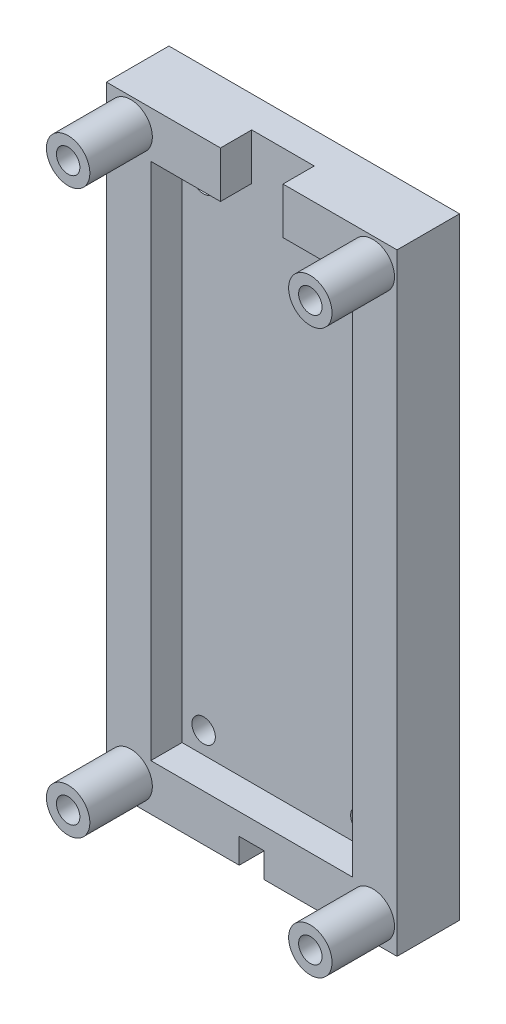
ISO-10303-21;
HEADER;
FILE_DESCRIPTION(('STEP AP214'),'2;1');
FILE_NAME('part.step','',(''),(''),'','','');
FILE_SCHEMA(('AUTOMOTIVE_DESIGN { 1 0 10303 214 1 1 1 1 }'));
ENDSEC;
DATA;
#1=APPLICATION_CONTEXT('core data for automotive mechanical design processes');
#2=APPLICATION_PROTOCOL_DEFINITION('international standard','automotive_design',2000,#1);
#3=PRODUCT_CONTEXT('',#1,'mechanical');
#4=PRODUCT('Part','Part','',(#3));
#5=PRODUCT_RELATED_PRODUCT_CATEGORY('part','',(#4));
#6=PRODUCT_DEFINITION_FORMATION('','',#4);
#7=PRODUCT_DEFINITION_CONTEXT('part definition',#1,'design');
#8=PRODUCT_DEFINITION('design','',#6,#7);
#9=PRODUCT_DEFINITION_SHAPE('','',#8);
#10=(LENGTH_UNIT() NAMED_UNIT(*) SI_UNIT(.MILLI.,.METRE.));
#11=(NAMED_UNIT(*) PLANE_ANGLE_UNIT() SI_UNIT($,.RADIAN.));
#12=(NAMED_UNIT(*) SI_UNIT($,.STERADIAN.) SOLID_ANGLE_UNIT());
#13=UNCERTAINTY_MEASURE_WITH_UNIT(LENGTH_MEASURE(1.E-05),#10,'distance_accuracy_value','');
#14=(GEOMETRIC_REPRESENTATION_CONTEXT(3) GLOBAL_UNCERTAINTY_ASSIGNED_CONTEXT((#13)) GLOBAL_UNIT_ASSIGNED_CONTEXT((#10,
#11,#12)) REPRESENTATION_CONTEXT('',''));
#15=CARTESIAN_POINT('',(0.,0.,0.));
#16=DIRECTION('',(0.,0.,1.));
#17=DIRECTION('',(1.,0.,0.));
#18=AXIS2_PLACEMENT_3D('',#15,#16,#17);
#19=CARTESIAN_POINT('',(0.,-7.425,5.));
#20=DIRECTION('',(0.,1.,0.));
#21=DIRECTION('',(-1.,0.,0.));
#22=AXIS2_PLACEMENT_3D('',#19,#20,#21);
#23=PLANE('',#22);
#24=DIRECTION('',(1.,0.,0.));
#25=VECTOR('',#24,1.);
#26=CARTESIAN_POINT('',(0.,-7.425,-5.));
#27=LINE('',#26,#25);
#28=CARTESIAN_POINT('',(-7.09999999999999,-7.425,-5.));
#29=VERTEX_POINT('',#28);
#30=CARTESIAN_POINT('',(14.15,-7.425,-5.));
#31=VERTEX_POINT('',#30);
#32=EDGE_CURVE('E369',#29,#31,#27,.T.);
#33=ORIENTED_EDGE('',*,*,#32,.T.);
#34=DIRECTION('',(0.,0.,1.));
#35=VECTOR('',#34,1.);
#36=CARTESIAN_POINT('',(14.15,-7.425,5.));
#37=LINE('',#36,#35);
#38=CARTESIAN_POINT('',(14.15,-7.425,5.));
#39=VERTEX_POINT('',#38);
#40=EDGE_CURVE('E193',#31,#39,#37,.T.);
#41=ORIENTED_EDGE('',*,*,#40,.T.);
#42=DIRECTION('',(1.,0.,0.));
#43=VECTOR('',#42,1.);
#44=CARTESIAN_POINT('',(0.,-7.425,5.));
#45=LINE('',#44,#43);
#46=CARTESIAN_POINT('',(-7.09999999999999,-7.425,5.));
#47=VERTEX_POINT('',#46);
#48=EDGE_CURVE('E351',#47,#39,#45,.T.);
#49=ORIENTED_EDGE('',*,*,#48,.F.);
#50=DIRECTION('',(0.,0.,-1.));
#51=VECTOR('',#50,1.);
#52=CARTESIAN_POINT('',(-7.09999999999999,-7.425,5.));
#53=LINE('',#52,#51);
#54=EDGE_CURVE('E390',#47,#29,#53,.T.);
#55=ORIENTED_EDGE('',*,*,#54,.T.);
#56=EDGE_LOOP('',(#33,#41,#49,#55));
#57=FACE_BOUND('',#56,.T.);
#58=ADVANCED_FACE('F64',(#57),#23,.F.);
#59=CARTESIAN_POINT('',(0.,83.05,5.));
#60=DIRECTION('',(0.,1.,0.));
#61=DIRECTION('',(0.,0.,1.));
#62=AXIS2_PLACEMENT_3D('',#59,#60,#61);
#63=PLANE('',#62);
#64=DIRECTION('',(1.,0.,0.));
#65=VECTOR('',#64,1.);
#66=CARTESIAN_POINT('',(0.,83.05,5.));
#67=LINE('',#66,#65);
#68=CARTESIAN_POINT('',(21.15,83.05,5.));
#69=VERTEX_POINT('',#68);
#70=CARTESIAN_POINT('',(32.3,83.05,5.));
#71=VERTEX_POINT('',#70);
#72=EDGE_CURVE('E341',#69,#71,#67,.T.);
#73=ORIENTED_EDGE('',*,*,#72,.F.);
#74=DIRECTION('',(0.,0.,-1.));
#75=VECTOR('',#74,1.);
#76=CARTESIAN_POINT('',(21.15,83.05,5.));
#77=LINE('',#76,#75);
#78=CARTESIAN_POINT('',(21.15,83.05,0.));
#79=VERTEX_POINT('',#78);
#80=EDGE_CURVE('E240',#69,#79,#77,.T.);
#81=ORIENTED_EDGE('',*,*,#80,.T.);
#82=DIRECTION('',(1.,0.,0.));
#83=VECTOR('',#82,1.);
#84=CARTESIAN_POINT('',(0.,83.05,0.));
#85=LINE('',#84,#83);
#86=CARTESIAN_POINT('',(32.3,83.05,0.));
#87=VERTEX_POINT('',#86);
#88=EDGE_CURVE('E319',#79,#87,#85,.T.);
#89=ORIENTED_EDGE('',*,*,#88,.T.);
#90=DIRECTION('',(0.,0.,-1.));
#91=VECTOR('',#90,1.);
#92=CARTESIAN_POINT('',(32.3,83.05,5.));
#93=LINE('',#92,#91);
#94=EDGE_CURVE('E364',#71,#87,#93,.T.);
#95=ORIENTED_EDGE('',*,*,#94,.F.);
#96=EDGE_LOOP('',(#73,#81,#89,#95));
#97=FACE_BOUND('',#96,.T.);
#98=ADVANCED_FACE('F470',(#97),#63,.F.);
#99=CARTESIAN_POINT('',(-7.09999999999999,0.,5.));
#100=DIRECTION('',(-1.,0.,0.));
#101=DIRECTION('',(0.,-1.,0.));
#102=AXIS2_PLACEMENT_3D('',#99,#100,#101);
#103=PLANE('',#102);
#104=DIRECTION('',(0.,1.,0.));
#105=VECTOR('',#104,1.);
#106=CARTESIAN_POINT('',(-7.09999999999999,0.,-5.));
#107=LINE('',#106,#105);
#108=CARTESIAN_POINT('',(-7.09999999999999,90.475,-5.));
#109=VERTEX_POINT('',#108);
#110=EDGE_CURVE('E328',#29,#109,#107,.T.);
#111=ORIENTED_EDGE('',*,*,#110,.F.);
#112=ORIENTED_EDGE('',*,*,#54,.F.);
#113=DIRECTION('',(0.,1.,0.));
#114=VECTOR('',#113,1.);
#115=CARTESIAN_POINT('',(-7.09999999999999,0.,5.));
#116=LINE('',#115,#114);
#117=CARTESIAN_POINT('',(-7.09999999999999,90.475,5.));
#118=VERTEX_POINT('',#117);
#119=EDGE_CURVE('E346',#47,#118,#116,.T.);
#120=ORIENTED_EDGE('',*,*,#119,.T.);
#121=DIRECTION('',(0.,0.,-1.));
#122=VECTOR('',#121,1.);
#123=CARTESIAN_POINT('',(-7.09999999999999,90.475,5.));
#124=LINE('',#123,#122);
#125=EDGE_CURVE('E379',#118,#109,#124,.T.);
#126=ORIENTED_EDGE('',*,*,#125,.T.);
#127=EDGE_LOOP('',(#111,#112,#120,#126));
#128=FACE_BOUND('',#127,.T.);
#129=ADVANCED_FACE('F487',(#128),#103,.T.);
#130=CARTESIAN_POINT('',(18.15,-7.425,5.));
#131=VERTEX_POINT('',#130);
#132=CARTESIAN_POINT('',(39.4,-7.42499999999999,5.));
#133=VERTEX_POINT('',#132);
#134=EDGE_CURVE('E350',#131,#133,#45,.T.);
#135=ORIENTED_EDGE('',*,*,#134,.F.);
#136=DIRECTION('',(0.,0.,-1.));
#137=VECTOR('',#136,1.);
#138=CARTESIAN_POINT('',(18.15,-7.425,5.));
#139=LINE('',#138,#137);
#140=CARTESIAN_POINT('',(18.15,-7.425,-5.));
#141=VERTEX_POINT('',#140);
#142=EDGE_CURVE('E186',#131,#141,#139,.T.);
#143=ORIENTED_EDGE('',*,*,#142,.T.);
#144=CARTESIAN_POINT('',(39.4,-7.42499999999999,-5.));
#145=VERTEX_POINT('',#144);
#146=EDGE_CURVE('E368',#141,#145,#27,.T.);
#147=ORIENTED_EDGE('',*,*,#146,.T.);
#148=DIRECTION('',(0.,0.,-1.));
#149=VECTOR('',#148,1.);
#150=CARTESIAN_POINT('',(39.4,-7.42499999999999,5.));
#151=LINE('',#150,#149);
#152=EDGE_CURVE('E386',#133,#145,#151,.T.);
#153=ORIENTED_EDGE('',*,*,#152,.F.);
#154=EDGE_LOOP('',(#135,#143,#147,#153));
#155=FACE_BOUND('',#154,.T.);
#156=ADVANCED_FACE('F492',(#155),#23,.F.);
#157=CARTESIAN_POINT('',(39.4,0.,5.));
#158=DIRECTION('',(-1.,0.,0.));
#159=DIRECTION('',(0.,0.,1.));
#160=AXIS2_PLACEMENT_3D('',#157,#158,#159);
#161=PLANE('',#160);
#162=DIRECTION('',(0.,1.,0.));
#163=VECTOR('',#162,1.);
#164=CARTESIAN_POINT('',(39.4,0.,-5.));
#165=LINE('',#164,#163);
#166=CARTESIAN_POINT('',(39.4,90.475,-5.));
#167=VERTEX_POINT('',#166);
#168=EDGE_CURVE('E372',#145,#167,#165,.T.);
#169=ORIENTED_EDGE('',*,*,#168,.T.);
#170=DIRECTION('',(0.,0.,-1.));
#171=VECTOR('',#170,1.);
#172=CARTESIAN_POINT('',(39.4,90.475,5.));
#173=LINE('',#172,#171);
#174=CARTESIAN_POINT('',(39.4,90.475,5.));
#175=VERTEX_POINT('',#174);
#176=EDGE_CURVE('E382',#175,#167,#173,.T.);
#177=ORIENTED_EDGE('',*,*,#176,.F.);
#178=DIRECTION('',(0.,1.,0.));
#179=VECTOR('',#178,1.);
#180=CARTESIAN_POINT('',(39.4,0.,5.));
#181=LINE('',#180,#179);
#182=EDGE_CURVE('E355',#133,#175,#181,.T.);
#183=ORIENTED_EDGE('',*,*,#182,.F.);
#184=ORIENTED_EDGE('',*,*,#152,.T.);
#185=EDGE_LOOP('',(#169,#177,#183,#184));
#186=FACE_BOUND('',#185,.T.);
#187=ADVANCED_FACE('F482',(#186),#161,.F.);
#188=CARTESIAN_POINT('',(32.3,0.,5.));
#189=DIRECTION('',(-1.,0.,0.));
#190=DIRECTION('',(0.,-1.,0.));
#191=AXIS2_PLACEMENT_3D('',#188,#189,#190);
#192=PLANE('',#191);
#193=DIRECTION('',(0.,1.,0.));
#194=VECTOR('',#193,1.);
#195=CARTESIAN_POINT('',(32.3,0.,0.));
#196=LINE('',#195,#194);
#197=CARTESIAN_POINT('',(32.3,0.,0.));
#198=VERTEX_POINT('',#197);
#199=EDGE_CURVE('E315',#198,#87,#196,.T.);
#200=ORIENTED_EDGE('',*,*,#199,.F.);
#201=DIRECTION('',(0.,0.,-1.));
#202=VECTOR('',#201,1.);
#203=CARTESIAN_POINT('',(32.3,0.,5.));
#204=LINE('',#203,#202);
#205=CARTESIAN_POINT('',(32.3,0.,5.));
#206=VERTEX_POINT('',#205);
#207=EDGE_CURVE('E383',#206,#198,#204,.T.);
#208=ORIENTED_EDGE('',*,*,#207,.F.);
#209=DIRECTION('',(0.,1.,0.));
#210=VECTOR('',#209,1.);
#211=CARTESIAN_POINT('',(32.3,0.,5.));
#212=LINE('',#211,#210);
#213=EDGE_CURVE('E329',#206,#71,#212,.T.);
#214=ORIENTED_EDGE('',*,*,#213,.T.);
#215=ORIENTED_EDGE('',*,*,#94,.T.);
#216=EDGE_LOOP('',(#200,#208,#214,#215));
#217=FACE_BOUND('',#216,.T.);
#218=ADVANCED_FACE('F66',(#217),#192,.T.);
#219=CARTESIAN_POINT('',(0.,0.,5.));
#220=DIRECTION('',(0.,1.,0.));
#221=DIRECTION('',(0.,0.,1.));
#222=AXIS2_PLACEMENT_3D('',#219,#220,#221);
#223=PLANE('',#222);
#224=DIRECTION('',(1.,0.,0.));
#225=VECTOR('',#224,1.);
#226=CARTESIAN_POINT('',(0.,0.,0.));
#227=LINE('',#226,#225);
#228=CARTESIAN_POINT('',(0.,0.,0.));
#229=VERTEX_POINT('',#228);
#230=EDGE_CURVE('E312',#229,#198,#227,.T.);
#231=ORIENTED_EDGE('',*,*,#230,.F.);
#232=DIRECTION('',(0.,0.,-1.));
#233=VECTOR('',#232,1.);
#234=CARTESIAN_POINT('',(0.,0.,5.));
#235=LINE('',#234,#233);
#236=CARTESIAN_POINT('',(0.,0.,5.));
#237=VERTEX_POINT('',#236);
#238=EDGE_CURVE('E401',#237,#229,#235,.T.);
#239=ORIENTED_EDGE('',*,*,#238,.F.);
#240=DIRECTION('',(1.,0.,0.));
#241=VECTOR('',#240,1.);
#242=CARTESIAN_POINT('',(0.,0.,5.));
#243=LINE('',#242,#241);
#244=EDGE_CURVE('E333',#237,#206,#243,.T.);
#245=ORIENTED_EDGE('',*,*,#244,.T.);
#246=ORIENTED_EDGE('',*,*,#207,.T.);
#247=EDGE_LOOP('',(#231,#239,#245,#246));
#248=FACE_BOUND('',#247,.T.);
#249=ADVANCED_FACE('F463',(#248),#223,.T.);
#250=CARTESIAN_POINT('',(0.,0.,5.));
#251=DIRECTION('',(-1.,0.,0.));
#252=DIRECTION('',(0.,-1.,0.));
#253=AXIS2_PLACEMENT_3D('',#250,#251,#252);
#254=PLANE('',#253);
#255=ORIENTED_EDGE('',*,*,#238,.T.);
#256=DIRECTION('',(0.,1.,0.));
#257=VECTOR('',#256,1.);
#258=CARTESIAN_POINT('',(0.,0.,0.));
#259=LINE('',#258,#257);
#260=CARTESIAN_POINT('',(0.,83.05,0.));
#261=VERTEX_POINT('',#260);
#262=EDGE_CURVE('E324',#229,#261,#259,.T.);
#263=ORIENTED_EDGE('',*,*,#262,.T.);
#264=DIRECTION('',(0.,0.,-1.));
#265=VECTOR('',#264,1.);
#266=CARTESIAN_POINT('',(0.,83.05,5.));
#267=LINE('',#266,#265);
#268=CARTESIAN_POINT('',(0.,83.05,5.));
#269=VERTEX_POINT('',#268);
#270=EDGE_CURVE('E397',#269,#261,#267,.T.);
#271=ORIENTED_EDGE('',*,*,#270,.F.);
#272=DIRECTION('',(0.,1.,0.));
#273=VECTOR('',#272,1.);
#274=CARTESIAN_POINT('',(0.,0.,5.));
#275=LINE('',#274,#273);
#276=EDGE_CURVE('E338',#237,#269,#275,.T.);
#277=ORIENTED_EDGE('',*,*,#276,.F.);
#278=EDGE_LOOP('',(#255,#263,#271,#277));
#279=FACE_BOUND('',#278,.T.);
#280=ADVANCED_FACE('F459',(#279),#254,.F.);
#281=CARTESIAN_POINT('',(11.15,83.05,0.));
#282=VERTEX_POINT('',#281);
#283=EDGE_CURVE('E320',#261,#282,#85,.T.);
#284=ORIENTED_EDGE('',*,*,#283,.T.);
#285=DIRECTION('',(0.,0.,1.));
#286=VECTOR('',#285,1.);
#287=CARTESIAN_POINT('',(11.15,83.05,5.));
#288=LINE('',#287,#286);
#289=CARTESIAN_POINT('',(11.15,83.05,5.));
#290=VERTEX_POINT('',#289);
#291=EDGE_CURVE('E230',#282,#290,#288,.T.);
#292=ORIENTED_EDGE('',*,*,#291,.T.);
#293=EDGE_CURVE('E342',#269,#290,#67,.T.);
#294=ORIENTED_EDGE('',*,*,#293,.F.);
#295=ORIENTED_EDGE('',*,*,#270,.T.);
#296=EDGE_LOOP('',(#284,#292,#294,#295));
#297=FACE_BOUND('',#296,.T.);
#298=ADVANCED_FACE('F449',(#297),#63,.F.);
#299=CARTESIAN_POINT('',(0.,90.475,5.));
#300=DIRECTION('',(0.,1.,0.));
#301=DIRECTION('',(0.,0.,1.));
#302=AXIS2_PLACEMENT_3D('',#299,#300,#301);
#303=PLANE('',#302);
#304=DIRECTION('',(0.,0.,-1.));
#305=VECTOR('',#304,1.);
#306=CARTESIAN_POINT('',(21.15,90.475,5.));
#307=LINE('',#306,#305);
#308=CARTESIAN_POINT('',(21.15,90.475,5.));
#309=VERTEX_POINT('',#308);
#310=CARTESIAN_POINT('',(21.15,90.475,0.));
#311=VERTEX_POINT('',#310);
#312=EDGE_CURVE('E237',#309,#311,#307,.T.);
#313=ORIENTED_EDGE('',*,*,#312,.F.);
#314=DIRECTION('',(1.,0.,0.));
#315=VECTOR('',#314,1.);
#316=CARTESIAN_POINT('',(0.,90.475,5.));
#317=LINE('',#316,#315);
#318=EDGE_CURVE('E359',#309,#175,#317,.T.);
#319=ORIENTED_EDGE('',*,*,#318,.T.);
#320=ORIENTED_EDGE('',*,*,#176,.T.);
#321=DIRECTION('',(1.,0.,0.));
#322=VECTOR('',#321,1.);
#323=CARTESIAN_POINT('',(0.,90.475,-5.));
#324=LINE('',#323,#322);
#325=EDGE_CURVE('E334',#109,#167,#324,.T.);
#326=ORIENTED_EDGE('',*,*,#325,.F.);
#327=ORIENTED_EDGE('',*,*,#125,.F.);
#328=CARTESIAN_POINT('',(11.15,90.475,5.));
#329=VERTEX_POINT('',#328);
#330=EDGE_CURVE('E360',#118,#329,#317,.T.);
#331=ORIENTED_EDGE('',*,*,#330,.T.);
#332=DIRECTION('',(0.,0.,1.));
#333=VECTOR('',#332,1.);
#334=CARTESIAN_POINT('',(11.15,90.475,5.));
#335=LINE('',#334,#333);
#336=CARTESIAN_POINT('',(11.15,90.475,0.));
#337=VERTEX_POINT('',#336);
#338=EDGE_CURVE('E88',#337,#329,#335,.T.);
#339=ORIENTED_EDGE('',*,*,#338,.F.);
#340=DIRECTION('',(1.,0.,0.));
#341=VECTOR('',#340,1.);
#342=CARTESIAN_POINT('',(0.,90.475,0.));
#343=LINE('',#342,#341);
#344=EDGE_CURVE('E73',#337,#311,#343,.T.);
#345=ORIENTED_EDGE('',*,*,#344,.T.);
#346=EDGE_LOOP('',(#313,#319,#320,#326,#327,#331,#339,#345));
#347=FACE_BOUND('',#346,.T.);
#348=ADVANCED_FACE('F438',(#347),#303,.T.);
#349=CARTESIAN_POINT('',(0.,0.,5.));
#350=DIRECTION('',(0.,0.,1.));
#351=DIRECTION('',(1.,0.,0.));
#352=AXIS2_PLACEMENT_3D('',#349,#350,#351);
#353=PLANE('',#352);
#354=DIRECTION('',(0.,-1.,0.));
#355=VECTOR('',#354,1.);
#356=CARTESIAN_POINT('',(14.15,-11.425,5.));
#357=LINE('',#356,#355);
#358=CARTESIAN_POINT('',(14.15,-3.425,5.));
#359=VERTEX_POINT('',#358);
#360=EDGE_CURVE('E206',#359,#39,#357,.T.);
#361=ORIENTED_EDGE('',*,*,#360,.F.);
#362=DIRECTION('',(-1.,0.,0.));
#363=VECTOR('',#362,1.);
#364=CARTESIAN_POINT('',(18.15,-3.425,5.));
#365=LINE('',#364,#363);
#366=CARTESIAN_POINT('',(18.15,-3.425,5.));
#367=VERTEX_POINT('',#366);
#368=EDGE_CURVE('E182',#367,#359,#365,.T.);
#369=ORIENTED_EDGE('',*,*,#368,.F.);
#370=DIRECTION('',(0.,1.,0.));
#371=VECTOR('',#370,1.);
#372=CARTESIAN_POINT('',(18.15,-11.425,5.));
#373=LINE('',#372,#371);
#374=EDGE_CURVE('E209',#131,#367,#373,.T.);
#375=ORIENTED_EDGE('',*,*,#374,.F.);
#376=ORIENTED_EDGE('',*,*,#134,.T.);
#377=ORIENTED_EDGE('',*,*,#182,.T.);
#378=ORIENTED_EDGE('',*,*,#318,.F.);
#379=DIRECTION('',(0.,1.,0.));
#380=VECTOR('',#379,1.);
#381=CARTESIAN_POINT('',(21.15,0.,5.));
#382=LINE('',#381,#380);
#383=EDGE_CURVE('E234',#69,#309,#382,.T.);
#384=ORIENTED_EDGE('',*,*,#383,.F.);
#385=ORIENTED_EDGE('',*,*,#72,.T.);
#386=ORIENTED_EDGE('',*,*,#213,.F.);
#387=ORIENTED_EDGE('',*,*,#244,.F.);
#388=ORIENTED_EDGE('',*,*,#276,.T.);
#389=ORIENTED_EDGE('',*,*,#293,.T.);
#390=DIRECTION('',(0.,-1.,0.));
#391=VECTOR('',#390,1.);
#392=CARTESIAN_POINT('',(11.15,0.,5.));
#393=LINE('',#392,#391);
#394=EDGE_CURVE('E225',#329,#290,#393,.T.);
#395=ORIENTED_EDGE('',*,*,#394,.F.);
#396=ORIENTED_EDGE('',*,*,#330,.F.);
#397=ORIENTED_EDGE('',*,*,#119,.F.);
#398=ORIENTED_EDGE('',*,*,#48,.T.);
#399=EDGE_LOOP('',(#361,#369,#375,#376,#377,#378,#384,#385,#386,#387,#388,#389,#395,#396,#397,#398));
#400=FACE_BOUND('',#399,.T.);
#401=CARTESIAN_POINT('',(35.525,-3.475,5.));
#402=DIRECTION('',(0.,0.,1.));
#403=DIRECTION('',(1.,0.,0.));
#404=AXIS2_PLACEMENT_3D('',#401,#402,#403);
#405=CIRCLE('',#404,3.47500000000001);
#406=CARTESIAN_POINT('',(39.,-3.475,5.));
#407=VERTEX_POINT('',#406);
#408=EDGE_CURVE('E252',#407,#407,#405,.F.);
#409=ORIENTED_EDGE('',*,*,#408,.T.);
#410=EDGE_LOOP('',(#409));
#411=FACE_BOUND('',#410,.T.);
#412=CARTESIAN_POINT('',(35.525,86.525,5.));
#413=DIRECTION('',(0.,0.,1.));
#414=DIRECTION('',(1.,0.,0.));
#415=AXIS2_PLACEMENT_3D('',#412,#413,#414);
#416=CIRCLE('',#415,3.47500000000001);
#417=CARTESIAN_POINT('',(39.,86.525,5.));
#418=VERTEX_POINT('',#417);
#419=EDGE_CURVE('E261',#418,#418,#416,.F.);
#420=ORIENTED_EDGE('',*,*,#419,.T.);
#421=EDGE_LOOP('',(#420));
#422=FACE_BOUND('',#421,.T.);
#423=CARTESIAN_POINT('',(-3.22500000000001,86.525,5.));
#424=DIRECTION('',(0.,0.,1.));
#425=DIRECTION('',(1.,0.,0.));
#426=AXIS2_PLACEMENT_3D('',#423,#424,#425);
#427=CIRCLE('',#426,3.475);
#428=CARTESIAN_POINT('',(0.249999999999995,86.525,5.));
#429=VERTEX_POINT('',#428);
#430=EDGE_CURVE('E270',#429,#429,#427,.F.);
#431=ORIENTED_EDGE('',*,*,#430,.T.);
#432=EDGE_LOOP('',(#431));
#433=FACE_BOUND('',#432,.T.);
#434=CARTESIAN_POINT('',(-3.22500000000001,-3.475,5.));
#435=DIRECTION('',(0.,0.,1.));
#436=DIRECTION('',(1.,0.,0.));
#437=AXIS2_PLACEMENT_3D('',#434,#435,#436);
#438=CIRCLE('',#437,3.475);
#439=CARTESIAN_POINT('',(0.249999999999995,-3.475,5.));
#440=VERTEX_POINT('',#439);
#441=EDGE_CURVE('E279',#440,#440,#438,.F.);
#442=ORIENTED_EDGE('',*,*,#441,.T.);
#443=EDGE_LOOP('',(#442));
#444=FACE_BOUND('',#443,.T.);
#445=ADVANCED_FACE('F451',(#400,#411,#422,#433,#444),#353,.T.);
#446=CARTESIAN_POINT('',(0.,0.,-5.));
#447=DIRECTION('',(0.,0.,1.));
#448=DIRECTION('',(1.,0.,0.));
#449=AXIS2_PLACEMENT_3D('',#446,#447,#448);
#450=PLANE('',#449);
#451=CARTESIAN_POINT('',(3.45,79.625,-5.));
#452=DIRECTION('',(0.,0.,1.));
#453=DIRECTION('',(1.,0.,0.));
#454=AXIS2_PLACEMENT_3D('',#451,#452,#453);
#455=CIRCLE('',#454,1.875);
#456=CARTESIAN_POINT('',(5.325,79.625,-5.));
#457=VERTEX_POINT('',#456);
#458=EDGE_CURVE('E284',#457,#457,#455,.T.);
#459=ORIENTED_EDGE('',*,*,#458,.T.);
#460=EDGE_LOOP('',(#459));
#461=FACE_BOUND('',#460,.T.);
#462=CARTESIAN_POINT('',(28.85,79.625,-5.));
#463=DIRECTION('',(0.,0.,1.));
#464=DIRECTION('',(1.,0.,0.));
#465=AXIS2_PLACEMENT_3D('',#462,#463,#464);
#466=CIRCLE('',#465,1.875);
#467=CARTESIAN_POINT('',(30.725,79.625,-5.));
#468=VERTEX_POINT('',#467);
#469=EDGE_CURVE('E292',#468,#468,#466,.T.);
#470=ORIENTED_EDGE('',*,*,#469,.T.);
#471=EDGE_LOOP('',(#470));
#472=FACE_BOUND('',#471,.T.);
#473=CARTESIAN_POINT('',(3.44999999999999,3.42500000000001,-5.));
#474=DIRECTION('',(0.,0.,1.));
#475=DIRECTION('',(1.,0.,0.));
#476=AXIS2_PLACEMENT_3D('',#473,#474,#475);
#477=CIRCLE('',#476,1.875);
#478=CARTESIAN_POINT('',(5.32499999999999,3.42500000000001,-5.));
#479=VERTEX_POINT('',#478);
#480=EDGE_CURVE('E300',#479,#479,#477,.T.);
#481=ORIENTED_EDGE('',*,*,#480,.T.);
#482=EDGE_LOOP('',(#481));
#483=FACE_BOUND('',#482,.T.);
#484=CARTESIAN_POINT('',(28.85,3.42500000000001,-5.));
#485=DIRECTION('',(0.,0.,1.));
#486=DIRECTION('',(1.,0.,0.));
#487=AXIS2_PLACEMENT_3D('',#484,#485,#486);
#488=CIRCLE('',#487,1.875);
#489=CARTESIAN_POINT('',(30.725,3.42500000000001,-5.));
#490=VERTEX_POINT('',#489);
#491=EDGE_CURVE('E308',#490,#490,#488,.T.);
#492=ORIENTED_EDGE('',*,*,#491,.T.);
#493=EDGE_LOOP('',(#492));
#494=FACE_BOUND('',#493,.T.);
#495=DIRECTION('',(-1.,0.,0.));
#496=VECTOR('',#495,1.);
#497=CARTESIAN_POINT('',(18.15,-3.425,-5.));
#498=LINE('',#497,#496);
#499=CARTESIAN_POINT('',(18.15,-3.425,-5.));
#500=VERTEX_POINT('',#499);
#501=CARTESIAN_POINT('',(14.15,-3.425,-5.));
#502=VERTEX_POINT('',#501);
#503=EDGE_CURVE('E80',#500,#502,#498,.T.);
#504=ORIENTED_EDGE('',*,*,#503,.T.);
#505=DIRECTION('',(0.,-1.,0.));
#506=VECTOR('',#505,1.);
#507=CARTESIAN_POINT('',(14.15,-11.425,-5.));
#508=LINE('',#507,#506);
#509=EDGE_CURVE('E190',#502,#31,#508,.T.);
#510=ORIENTED_EDGE('',*,*,#509,.T.);
#511=ORIENTED_EDGE('',*,*,#32,.F.);
#512=ORIENTED_EDGE('',*,*,#110,.T.);
#513=ORIENTED_EDGE('',*,*,#325,.T.);
#514=ORIENTED_EDGE('',*,*,#168,.F.);
#515=ORIENTED_EDGE('',*,*,#146,.F.);
#516=DIRECTION('',(0.,1.,0.));
#517=VECTOR('',#516,1.);
#518=CARTESIAN_POINT('',(18.15,0.,-5.));
#519=LINE('',#518,#517);
#520=EDGE_CURVE('E12',#141,#500,#519,.T.);
#521=ORIENTED_EDGE('',*,*,#520,.T.);
#522=EDGE_LOOP('',(#504,#510,#511,#512,#513,#514,#515,#521));
#523=FACE_BOUND('',#522,.T.);
#524=ADVANCED_FACE('F199',(#461,#472,#483,#494,#523),#450,.F.);
#525=CARTESIAN_POINT('',(0.,0.,0.));
#526=DIRECTION('',(0.,0.,1.));
#527=DIRECTION('',(1.,0.,0.));
#528=AXIS2_PLACEMENT_3D('',#525,#526,#527);
#529=PLANE('',#528);
#530=ORIENTED_EDGE('',*,*,#88,.F.);
#531=DIRECTION('',(0.,-1.,0.));
#532=VECTOR('',#531,1.);
#533=CARTESIAN_POINT('',(21.15,75.55,0.));
#534=LINE('',#533,#532);
#535=EDGE_CURVE('E222',#311,#79,#534,.T.);
#536=ORIENTED_EDGE('',*,*,#535,.F.);
#537=ORIENTED_EDGE('',*,*,#344,.F.);
#538=DIRECTION('',(0.,1.,0.));
#539=VECTOR('',#538,1.);
#540=CARTESIAN_POINT('',(11.15,75.55,0.));
#541=LINE('',#540,#539);
#542=EDGE_CURVE('E219',#282,#337,#541,.T.);
#543=ORIENTED_EDGE('',*,*,#542,.F.);
#544=ORIENTED_EDGE('',*,*,#283,.F.);
#545=ORIENTED_EDGE('',*,*,#262,.F.);
#546=ORIENTED_EDGE('',*,*,#230,.T.);
#547=ORIENTED_EDGE('',*,*,#199,.T.);
#548=EDGE_LOOP('',(#530,#536,#537,#543,#544,#545,#546,#547));
#549=FACE_BOUND('',#548,.T.);
#550=CARTESIAN_POINT('',(3.45,79.625,0.));
#551=DIRECTION('',(0.,0.,1.));
#552=DIRECTION('',(1.,0.,0.));
#553=AXIS2_PLACEMENT_3D('',#550,#551,#552);
#554=CIRCLE('',#553,1.875);
#555=CARTESIAN_POINT('',(5.325,79.625,0.));
#556=VERTEX_POINT('',#555);
#557=EDGE_CURVE('E280',#556,#556,#554,.T.);
#558=ORIENTED_EDGE('',*,*,#557,.F.);
#559=EDGE_LOOP('',(#558));
#560=FACE_BOUND('',#559,.T.);
#561=CARTESIAN_POINT('',(28.85,79.625,0.));
#562=DIRECTION('',(0.,0.,1.));
#563=DIRECTION('',(1.,0.,0.));
#564=AXIS2_PLACEMENT_3D('',#561,#562,#563);
#565=CIRCLE('',#564,1.875);
#566=CARTESIAN_POINT('',(30.725,79.625,0.));
#567=VERTEX_POINT('',#566);
#568=EDGE_CURVE('E288',#567,#567,#565,.T.);
#569=ORIENTED_EDGE('',*,*,#568,.F.);
#570=EDGE_LOOP('',(#569));
#571=FACE_BOUND('',#570,.T.);
#572=CARTESIAN_POINT('',(3.44999999999999,3.42500000000001,0.));
#573=DIRECTION('',(0.,0.,1.));
#574=DIRECTION('',(1.,0.,0.));
#575=AXIS2_PLACEMENT_3D('',#572,#573,#574);
#576=CIRCLE('',#575,1.875);
#577=CARTESIAN_POINT('',(5.32499999999999,3.42500000000001,0.));
#578=VERTEX_POINT('',#577);
#579=EDGE_CURVE('E296',#578,#578,#576,.T.);
#580=ORIENTED_EDGE('',*,*,#579,.F.);
#581=EDGE_LOOP('',(#580));
#582=FACE_BOUND('',#581,.T.);
#583=CARTESIAN_POINT('',(28.85,3.42500000000001,0.));
#584=DIRECTION('',(0.,0.,1.));
#585=DIRECTION('',(1.,0.,0.));
#586=AXIS2_PLACEMENT_3D('',#583,#584,#585);
#587=CIRCLE('',#586,1.875);
#588=CARTESIAN_POINT('',(30.725,3.42500000000001,0.));
#589=VERTEX_POINT('',#588);
#590=EDGE_CURVE('E304',#589,#589,#587,.T.);
#591=ORIENTED_EDGE('',*,*,#590,.F.);
#592=EDGE_LOOP('',(#591));
#593=FACE_BOUND('',#592,.T.);
#594=ADVANCED_FACE('F444',(#549,#560,#571,#582,#593),#529,.T.);
#595=CARTESIAN_POINT('',(28.85,3.42500000000001,0.));
#596=DIRECTION('',(0.,0.,1.));
#597=DIRECTION('',(1.,0.,0.));
#598=AXIS2_PLACEMENT_3D('',#595,#596,#597);
#599=CYLINDRICAL_SURFACE('',#598,1.875);
#600=ORIENTED_EDGE('',*,*,#491,.F.);
#601=EDGE_LOOP('',(#600));
#602=FACE_BOUND('',#601,.T.);
#603=ORIENTED_EDGE('',*,*,#590,.T.);
#604=EDGE_LOOP('',(#603));
#605=FACE_BOUND('',#604,.T.);
#606=ADVANCED_FACE('F585',(#602,#605),#599,.F.);
#607=CARTESIAN_POINT('',(3.44999999999999,3.42500000000001,0.));
#608=DIRECTION('',(0.,0.,1.));
#609=DIRECTION('',(1.,0.,0.));
#610=AXIS2_PLACEMENT_3D('',#607,#608,#609);
#611=CYLINDRICAL_SURFACE('',#610,1.875);
#612=ORIENTED_EDGE('',*,*,#480,.F.);
#613=EDGE_LOOP('',(#612));
#614=FACE_BOUND('',#613,.T.);
#615=ORIENTED_EDGE('',*,*,#579,.T.);
#616=EDGE_LOOP('',(#615));
#617=FACE_BOUND('',#616,.T.);
#618=ADVANCED_FACE('F581',(#614,#617),#611,.F.);
#619=CARTESIAN_POINT('',(28.85,79.625,0.));
#620=DIRECTION('',(0.,0.,1.));
#621=DIRECTION('',(1.,0.,0.));
#622=AXIS2_PLACEMENT_3D('',#619,#620,#621);
#623=CYLINDRICAL_SURFACE('',#622,1.875);
#624=ORIENTED_EDGE('',*,*,#469,.F.);
#625=EDGE_LOOP('',(#624));
#626=FACE_BOUND('',#625,.T.);
#627=ORIENTED_EDGE('',*,*,#568,.T.);
#628=EDGE_LOOP('',(#627));
#629=FACE_BOUND('',#628,.T.);
#630=ADVANCED_FACE('F577',(#626,#629),#623,.F.);
#631=CARTESIAN_POINT('',(3.45,79.625,0.));
#632=DIRECTION('',(0.,0.,1.));
#633=DIRECTION('',(1.,0.,0.));
#634=AXIS2_PLACEMENT_3D('',#631,#632,#633);
#635=CYLINDRICAL_SURFACE('',#634,1.875);
#636=ORIENTED_EDGE('',*,*,#458,.F.);
#637=EDGE_LOOP('',(#636));
#638=FACE_BOUND('',#637,.T.);
#639=ORIENTED_EDGE('',*,*,#557,.T.);
#640=EDGE_LOOP('',(#639));
#641=FACE_BOUND('',#640,.T.);
#642=ADVANCED_FACE('F573',(#638,#641),#635,.F.);
#643=CARTESIAN_POINT('',(-3.22500000000001,-3.475,15.));
#644=DIRECTION('',(0.,0.,-1.));
#645=DIRECTION('',(-1.,0.,0.));
#646=AXIS2_PLACEMENT_3D('',#643,#644,#645);
#647=CYLINDRICAL_SURFACE('',#646,1.875);
#648=CARTESIAN_POINT('',(-3.22500000000001,-3.475,5.));
#649=DIRECTION('',(0.,0.,1.));
#650=DIRECTION('',(1.,0.,0.));
#651=AXIS2_PLACEMENT_3D('',#648,#649,#650);
#652=CIRCLE('',#651,1.875);
#653=CARTESIAN_POINT('',(-1.35000000000001,-3.475,5.));
#654=VERTEX_POINT('',#653);
#655=EDGE_CURVE('E393',#654,#654,#652,.F.);
#656=ORIENTED_EDGE('',*,*,#655,.T.);
#657=EDGE_LOOP('',(#656));
#658=FACE_BOUND('',#657,.T.);
#659=CARTESIAN_POINT('',(-3.22500000000001,-3.475,15.));
#660=DIRECTION('',(0.,0.,1.));
#661=DIRECTION('',(1.,0.,0.));
#662=AXIS2_PLACEMENT_3D('',#659,#660,#661);
#663=CIRCLE('',#662,1.875);
#664=CARTESIAN_POINT('',(-1.35000000000001,-3.475,15.));
#665=VERTEX_POINT('',#664);
#666=EDGE_CURVE('E271',#665,#665,#663,.T.);
#667=ORIENTED_EDGE('',*,*,#666,.T.);
#668=EDGE_LOOP('',(#667));
#669=FACE_BOUND('',#668,.T.);
#670=ADVANCED_FACE('F569',(#658,#669),#647,.F.);
#671=CARTESIAN_POINT('',(-3.22500000000001,-3.475,15.));
#672=DIRECTION('',(0.,0.,-1.));
#673=DIRECTION('',(-1.,0.,0.));
#674=AXIS2_PLACEMENT_3D('',#671,#672,#673);
#675=CYLINDRICAL_SURFACE('',#674,3.475);
#676=ORIENTED_EDGE('',*,*,#441,.F.);
#677=EDGE_LOOP('',(#676));
#678=FACE_BOUND('',#677,.T.);
#679=CARTESIAN_POINT('',(-3.22500000000001,-3.475,15.));
#680=DIRECTION('',(0.,0.,1.));
#681=DIRECTION('',(1.,0.,0.));
#682=AXIS2_PLACEMENT_3D('',#679,#680,#681);
#683=CIRCLE('',#682,3.475);
#684=CARTESIAN_POINT('',(0.249999999999995,-3.475,15.));
#685=VERTEX_POINT('',#684);
#686=EDGE_CURVE('E275',#685,#685,#683,.T.);
#687=ORIENTED_EDGE('',*,*,#686,.F.);
#688=EDGE_LOOP('',(#687));
#689=FACE_BOUND('',#688,.T.);
#690=ADVANCED_FACE('F565',(#678,#689),#675,.T.);
#691=CARTESIAN_POINT('',(0.,0.,15.));
#692=DIRECTION('',(0.,0.,1.));
#693=DIRECTION('',(1.,0.,0.));
#694=AXIS2_PLACEMENT_3D('',#691,#692,#693);
#695=PLANE('',#694);
#696=ORIENTED_EDGE('',*,*,#666,.F.);
#697=EDGE_LOOP('',(#696));
#698=FACE_BOUND('',#697,.T.);
#699=ORIENTED_EDGE('',*,*,#686,.T.);
#700=EDGE_LOOP('',(#699));
#701=FACE_BOUND('',#700,.T.);
#702=ADVANCED_FACE('F562',(#698,#701),#695,.T.);
#703=ORIENTED_EDGE('',*,*,#655,.F.);
#704=EDGE_LOOP('',(#703));
#705=FACE_BOUND('',#704,.T.);
#706=ADVANCED_FACE('F557',(#705),#353,.T.);
#707=CARTESIAN_POINT('',(-3.22500000000001,86.525,15.));
#708=DIRECTION('',(0.,0.,1.));
#709=DIRECTION('',(1.,0.,0.));
#710=AXIS2_PLACEMENT_3D('',#707,#708,#709);
#711=PLANE('',#710);
#712=CARTESIAN_POINT('',(-3.22500000000001,86.525,15.));
#713=DIRECTION('',(0.,0.,1.));
#714=DIRECTION('',(1.,0.,0.));
#715=AXIS2_PLACEMENT_3D('',#712,#713,#714);
#716=CIRCLE('',#715,3.475);
#717=CARTESIAN_POINT('',(0.249999999999995,86.525,15.));
#718=VERTEX_POINT('',#717);
#719=EDGE_CURVE('E262',#718,#718,#716,.T.);
#720=ORIENTED_EDGE('',*,*,#719,.T.);
#721=EDGE_LOOP('',(#720));
#722=FACE_BOUND('',#721,.T.);
#723=CARTESIAN_POINT('',(-3.22500000000001,86.525,15.));
#724=DIRECTION('',(0.,0.,1.));
#725=DIRECTION('',(1.,0.,0.));
#726=AXIS2_PLACEMENT_3D('',#723,#724,#725);
#727=CIRCLE('',#726,1.875);
#728=CARTESIAN_POINT('',(-1.35000000000001,86.525,15.));
#729=VERTEX_POINT('',#728);
#730=EDGE_CURVE('E266',#729,#729,#727,.T.);
#731=ORIENTED_EDGE('',*,*,#730,.F.);
#732=EDGE_LOOP('',(#731));
#733=FACE_BOUND('',#732,.T.);
#734=ADVANCED_FACE('F553',(#722,#733),#711,.T.);
#735=CARTESIAN_POINT('',(-3.22500000000001,86.525,15.));
#736=DIRECTION('',(0.,0.,-1.));
#737=DIRECTION('',(-1.,0.,0.));
#738=AXIS2_PLACEMENT_3D('',#735,#736,#737);
#739=CYLINDRICAL_SURFACE('',#738,3.475);
#740=ORIENTED_EDGE('',*,*,#430,.F.);
#741=EDGE_LOOP('',(#740));
#742=FACE_BOUND('',#741,.T.);
#743=ORIENTED_EDGE('',*,*,#719,.F.);
#744=EDGE_LOOP('',(#743));
#745=FACE_BOUND('',#744,.T.);
#746=ADVANCED_FACE('F549',(#742,#745),#739,.T.);
#747=CARTESIAN_POINT('',(-3.22500000000001,86.525,15.));
#748=DIRECTION('',(0.,0.,-1.));
#749=DIRECTION('',(-1.,0.,0.));
#750=AXIS2_PLACEMENT_3D('',#747,#748,#749);
#751=CYLINDRICAL_SURFACE('',#750,1.875);
#752=CARTESIAN_POINT('',(-3.22500000000001,86.525,5.));
#753=DIRECTION('',(0.,0.,1.));
#754=DIRECTION('',(1.,0.,0.));
#755=AXIS2_PLACEMENT_3D('',#752,#753,#754);
#756=CIRCLE('',#755,1.875);
#757=CARTESIAN_POINT('',(-1.35000000000001,86.525,5.));
#758=VERTEX_POINT('',#757);
#759=EDGE_CURVE('E414',#758,#758,#756,.F.);
#760=ORIENTED_EDGE('',*,*,#759,.T.);
#761=EDGE_LOOP('',(#760));
#762=FACE_BOUND('',#761,.T.);
#763=ORIENTED_EDGE('',*,*,#730,.T.);
#764=EDGE_LOOP('',(#763));
#765=FACE_BOUND('',#764,.T.);
#766=ADVANCED_FACE('F552',(#762,#765),#751,.F.);
#767=ORIENTED_EDGE('',*,*,#759,.F.);
#768=EDGE_LOOP('',(#767));
#769=FACE_BOUND('',#768,.T.);
#770=ADVANCED_FACE('F544',(#769),#353,.T.);
#771=CARTESIAN_POINT('',(35.525,86.525,15.));
#772=DIRECTION('',(0.,0.,1.));
#773=DIRECTION('',(1.,0.,0.));
#774=AXIS2_PLACEMENT_3D('',#771,#772,#773);
#775=PLANE('',#774);
#776=CARTESIAN_POINT('',(35.525,86.525,15.));
#777=DIRECTION('',(0.,0.,1.));
#778=DIRECTION('',(1.,0.,0.));
#779=AXIS2_PLACEMENT_3D('',#776,#777,#778);
#780=CIRCLE('',#779,3.47500000000001);
#781=CARTESIAN_POINT('',(39.,86.525,15.));
#782=VERTEX_POINT('',#781);
#783=EDGE_CURVE('E253',#782,#782,#780,.T.);
#784=ORIENTED_EDGE('',*,*,#783,.T.);
#785=EDGE_LOOP('',(#784));
#786=FACE_BOUND('',#785,.T.);
#787=CARTESIAN_POINT('',(35.525,86.525,15.));
#788=DIRECTION('',(0.,0.,1.));
#789=DIRECTION('',(1.,0.,0.));
#790=AXIS2_PLACEMENT_3D('',#787,#788,#789);
#791=CIRCLE('',#790,1.875);
#792=CARTESIAN_POINT('',(37.4,86.525,15.));
#793=VERTEX_POINT('',#792);
#794=EDGE_CURVE('E257',#793,#793,#791,.T.);
#795=ORIENTED_EDGE('',*,*,#794,.F.);
#796=EDGE_LOOP('',(#795));
#797=FACE_BOUND('',#796,.T.);
#798=ADVANCED_FACE('F540',(#786,#797),#775,.T.);
#799=CARTESIAN_POINT('',(35.525,86.525,15.));
#800=DIRECTION('',(0.,0.,-1.));
#801=DIRECTION('',(-1.,0.,0.));
#802=AXIS2_PLACEMENT_3D('',#799,#800,#801);
#803=CYLINDRICAL_SURFACE('',#802,3.47500000000001);
#804=ORIENTED_EDGE('',*,*,#419,.F.);
#805=EDGE_LOOP('',(#804));
#806=FACE_BOUND('',#805,.T.);
#807=ORIENTED_EDGE('',*,*,#783,.F.);
#808=EDGE_LOOP('',(#807));
#809=FACE_BOUND('',#808,.T.);
#810=ADVANCED_FACE('F536',(#806,#809),#803,.T.);
#811=CARTESIAN_POINT('',(35.525,86.525,15.));
#812=DIRECTION('',(0.,0.,-1.));
#813=DIRECTION('',(-1.,0.,0.));
#814=AXIS2_PLACEMENT_3D('',#811,#812,#813);
#815=CYLINDRICAL_SURFACE('',#814,1.875);
#816=CARTESIAN_POINT('',(35.525,86.525,5.));
#817=DIRECTION('',(0.,0.,1.));
#818=DIRECTION('',(1.,0.,0.));
#819=AXIS2_PLACEMENT_3D('',#816,#817,#818);
#820=CIRCLE('',#819,1.875);
#821=CARTESIAN_POINT('',(37.4,86.525,5.));
#822=VERTEX_POINT('',#821);
#823=EDGE_CURVE('E418',#822,#822,#820,.F.);
#824=ORIENTED_EDGE('',*,*,#823,.T.);
#825=EDGE_LOOP('',(#824));
#826=FACE_BOUND('',#825,.T.);
#827=ORIENTED_EDGE('',*,*,#794,.T.);
#828=EDGE_LOOP('',(#827));
#829=FACE_BOUND('',#828,.T.);
#830=ADVANCED_FACE('F539',(#826,#829),#815,.F.);
#831=ORIENTED_EDGE('',*,*,#823,.F.);
#832=EDGE_LOOP('',(#831));
#833=FACE_BOUND('',#832,.T.);
#834=ADVANCED_FACE('F531',(#833),#353,.T.);
#835=CARTESIAN_POINT('',(35.525,-3.475,15.));
#836=DIRECTION('',(0.,0.,1.));
#837=DIRECTION('',(1.,0.,0.));
#838=AXIS2_PLACEMENT_3D('',#835,#836,#837);
#839=PLANE('',#838);
#840=CARTESIAN_POINT('',(35.525,-3.475,15.));
#841=DIRECTION('',(0.,0.,1.));
#842=DIRECTION('',(1.,0.,0.));
#843=AXIS2_PLACEMENT_3D('',#840,#841,#842);
#844=CIRCLE('',#843,3.47500000000001);
#845=CARTESIAN_POINT('',(39.,-3.475,15.));
#846=VERTEX_POINT('',#845);
#847=EDGE_CURVE('E244',#846,#846,#844,.T.);
#848=ORIENTED_EDGE('',*,*,#847,.T.);
#849=EDGE_LOOP('',(#848));
#850=FACE_BOUND('',#849,.T.);
#851=CARTESIAN_POINT('',(35.525,-3.475,15.));
#852=DIRECTION('',(0.,0.,1.));
#853=DIRECTION('',(1.,0.,0.));
#854=AXIS2_PLACEMENT_3D('',#851,#852,#853);
#855=CIRCLE('',#854,1.875);
#856=CARTESIAN_POINT('',(37.4,-3.475,15.));
#857=VERTEX_POINT('',#856);
#858=EDGE_CURVE('E248',#857,#857,#855,.T.);
#859=ORIENTED_EDGE('',*,*,#858,.F.);
#860=EDGE_LOOP('',(#859));
#861=FACE_BOUND('',#860,.T.);
#862=ADVANCED_FACE('F527',(#850,#861),#839,.T.);
#863=CARTESIAN_POINT('',(35.525,-3.475,15.));
#864=DIRECTION('',(0.,0.,-1.));
#865=DIRECTION('',(-1.,0.,0.));
#866=AXIS2_PLACEMENT_3D('',#863,#864,#865);
#867=CYLINDRICAL_SURFACE('',#866,3.47500000000001);
#868=ORIENTED_EDGE('',*,*,#408,.F.);
#869=EDGE_LOOP('',(#868));
#870=FACE_BOUND('',#869,.T.);
#871=ORIENTED_EDGE('',*,*,#847,.F.);
#872=EDGE_LOOP('',(#871));
#873=FACE_BOUND('',#872,.T.);
#874=ADVANCED_FACE('F523',(#870,#873),#867,.T.);
#875=CARTESIAN_POINT('',(35.525,-3.475,15.));
#876=DIRECTION('',(0.,0.,-1.));
#877=DIRECTION('',(-1.,0.,0.));
#878=AXIS2_PLACEMENT_3D('',#875,#876,#877);
#879=CYLINDRICAL_SURFACE('',#878,1.875);
#880=CARTESIAN_POINT('',(35.525,-3.475,5.));
#881=DIRECTION('',(0.,0.,1.));
#882=DIRECTION('',(1.,0.,0.));
#883=AXIS2_PLACEMENT_3D('',#880,#881,#882);
#884=CIRCLE('',#883,1.875);
#885=CARTESIAN_POINT('',(37.4,-3.475,5.));
#886=VERTEX_POINT('',#885);
#887=EDGE_CURVE('E425',#886,#886,#884,.F.);
#888=ORIENTED_EDGE('',*,*,#887,.T.);
#889=EDGE_LOOP('',(#888));
#890=FACE_BOUND('',#889,.T.);
#891=ORIENTED_EDGE('',*,*,#858,.T.);
#892=EDGE_LOOP('',(#891));
#893=FACE_BOUND('',#892,.T.);
#894=ADVANCED_FACE('F526',(#890,#893),#879,.F.);
#895=ORIENTED_EDGE('',*,*,#887,.F.);
#896=EDGE_LOOP('',(#895));
#897=FACE_BOUND('',#896,.T.);
#898=ADVANCED_FACE('F521',(#897),#353,.T.);
#899=CARTESIAN_POINT('',(21.15,75.55,-18.0277563773199));
#900=DIRECTION('',(1.,0.,0.));
#901=DIRECTION('',(0.,0.,-1.));
#902=AXIS2_PLACEMENT_3D('',#899,#900,#901);
#903=PLANE('',#902);
#904=ORIENTED_EDGE('',*,*,#383,.T.);
#905=ORIENTED_EDGE('',*,*,#312,.T.);
#906=ORIENTED_EDGE('',*,*,#535,.T.);
#907=ORIENTED_EDGE('',*,*,#80,.F.);
#908=EDGE_LOOP('',(#904,#905,#906,#907));
#909=FACE_BOUND('',#908,.T.);
#910=ADVANCED_FACE('F518',(#909),#903,.F.);
#911=CARTESIAN_POINT('',(11.15,75.55,-18.0277563773199));
#912=DIRECTION('',(-1.,0.,0.));
#913=DIRECTION('',(0.,0.,1.));
#914=AXIS2_PLACEMENT_3D('',#911,#912,#913);
#915=PLANE('',#914);
#916=ORIENTED_EDGE('',*,*,#542,.T.);
#917=ORIENTED_EDGE('',*,*,#338,.T.);
#918=ORIENTED_EDGE('',*,*,#394,.T.);
#919=ORIENTED_EDGE('',*,*,#291,.F.);
#920=EDGE_LOOP('',(#916,#917,#918,#919));
#921=FACE_BOUND('',#920,.T.);
#922=ADVANCED_FACE('F446',(#921),#915,.F.);
#923=CARTESIAN_POINT('',(14.15,-11.425,-5.));
#924=DIRECTION('',(-1.,0.,0.));
#925=DIRECTION('',(0.,0.,1.));
#926=AXIS2_PLACEMENT_3D('',#923,#924,#925);
#927=PLANE('',#926);
#928=ORIENTED_EDGE('',*,*,#509,.F.);
#929=DIRECTION('',(0.,0.,1.));
#930=VECTOR('',#929,1.);
#931=CARTESIAN_POINT('',(14.15,-3.425,-5.));
#932=LINE('',#931,#930);
#933=EDGE_CURVE('E178',#502,#359,#932,.T.);
#934=ORIENTED_EDGE('',*,*,#933,.T.);
#935=ORIENTED_EDGE('',*,*,#360,.T.);
#936=ORIENTED_EDGE('',*,*,#40,.F.);
#937=EDGE_LOOP('',(#928,#934,#935,#936));
#938=FACE_BOUND('',#937,.T.);
#939=ADVANCED_FACE('F191',(#938),#927,.F.);
#940=CARTESIAN_POINT('',(18.15,-11.425,-5.));
#941=DIRECTION('',(1.,0.,0.));
#942=DIRECTION('',(0.,0.,-1.));
#943=AXIS2_PLACEMENT_3D('',#940,#941,#942);
#944=PLANE('',#943);
#945=ORIENTED_EDGE('',*,*,#374,.T.);
#946=DIRECTION('',(0.,0.,1.));
#947=VECTOR('',#946,1.);
#948=CARTESIAN_POINT('',(18.15,-3.425,-5.));
#949=LINE('',#948,#947);
#950=EDGE_CURVE('E187',#500,#367,#949,.T.);
#951=ORIENTED_EDGE('',*,*,#950,.F.);
#952=ORIENTED_EDGE('',*,*,#520,.F.);
#953=ORIENTED_EDGE('',*,*,#142,.F.);
#954=EDGE_LOOP('',(#945,#951,#952,#953));
#955=FACE_BOUND('',#954,.T.);
#956=ADVANCED_FACE('F506',(#955),#944,.F.);
#957=CARTESIAN_POINT('',(18.15,-3.425,-5.));
#958=DIRECTION('',(0.,1.,0.));
#959=DIRECTION('',(-1.,0.,0.));
#960=AXIS2_PLACEMENT_3D('',#957,#958,#959);
#961=PLANE('',#960);
#962=ORIENTED_EDGE('',*,*,#368,.T.);
#963=ORIENTED_EDGE('',*,*,#933,.F.);
#964=ORIENTED_EDGE('',*,*,#503,.F.);
#965=ORIENTED_EDGE('',*,*,#950,.T.);
#966=EDGE_LOOP('',(#962,#963,#964,#965));
#967=FACE_BOUND('',#966,.T.);
#968=ADVANCED_FACE('F180',(#967),#961,.F.);
#969=CLOSED_SHELL('',(#58,#98,#129,#156,#187,#218,#249,#280,#298,#348,#445,#524,#594,#606,#618,
#630,#642,#670,#690,#702,#706,#734,#746,#766,#770,#798,#810,#830,#834,#862,#874,#894,#898,#910,
#922,#939,#956,#968));
#970=MANIFOLD_SOLID_BREP('B2',#969);
#971=ADVANCED_BREP_SHAPE_REPRESENTATION('',(#18,#970),#14);
#972=SHAPE_DEFINITION_REPRESENTATION(#9,#971);
ENDSEC;
END-ISO-10303-21;
